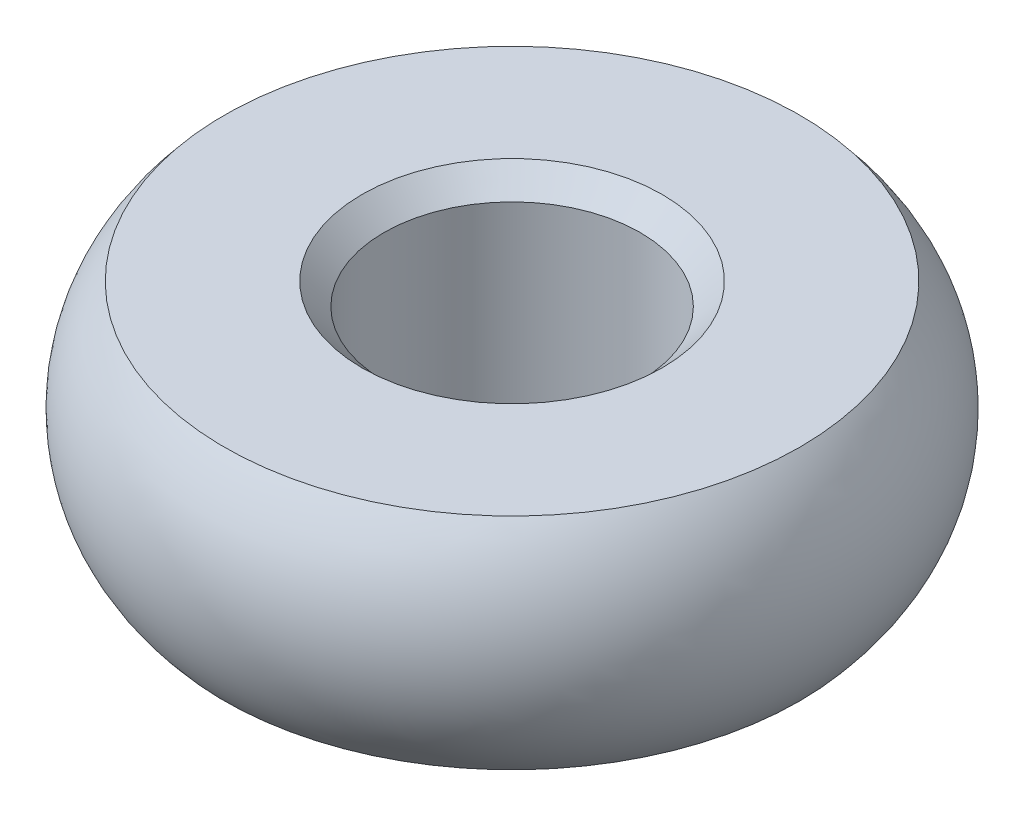
ISO-10303-21;
HEADER;
FILE_DESCRIPTION(('STEP AP214'),'2;1');
FILE_NAME('part.step','',(''),(''),'','','');
FILE_SCHEMA(('AUTOMOTIVE_DESIGN { 1 0 10303 214 1 1 1 1 }'));
ENDSEC;
DATA;
#1=APPLICATION_CONTEXT('core data for automotive mechanical design processes');
#2=APPLICATION_PROTOCOL_DEFINITION('international standard','automotive_design',2000,#1);
#3=PRODUCT_CONTEXT('',#1,'mechanical');
#4=PRODUCT('Part','Part','',(#3));
#5=PRODUCT_RELATED_PRODUCT_CATEGORY('part','',(#4));
#6=PRODUCT_DEFINITION_FORMATION('','',#4);
#7=PRODUCT_DEFINITION_CONTEXT('part definition',#1,'design');
#8=PRODUCT_DEFINITION('design','',#6,#7);
#9=PRODUCT_DEFINITION_SHAPE('','',#8);
#10=(LENGTH_UNIT() NAMED_UNIT(*) SI_UNIT(.MILLI.,.METRE.));
#11=(NAMED_UNIT(*) PLANE_ANGLE_UNIT() SI_UNIT($,.RADIAN.));
#12=(NAMED_UNIT(*) SI_UNIT($,.STERADIAN.) SOLID_ANGLE_UNIT());
#13=UNCERTAINTY_MEASURE_WITH_UNIT(LENGTH_MEASURE(1.E-05),#10,'distance_accuracy_value','');
#14=(GEOMETRIC_REPRESENTATION_CONTEXT(3) GLOBAL_UNCERTAINTY_ASSIGNED_CONTEXT((#13)) GLOBAL_UNIT_ASSIGNED_CONTEXT((#10,
#11,#12)) REPRESENTATION_CONTEXT('',''));
#15=CARTESIAN_POINT('',(0.,0.,0.));
#16=DIRECTION('',(0.,0.,1.));
#17=DIRECTION('',(1.,0.,0.));
#18=AXIS2_PLACEMENT_3D('',#15,#16,#17);
#19=CARTESIAN_POINT('',(0.,-1.11022302462516E-13,0.));
#20=DIRECTION('',(0.,-1.,0.));
#21=DIRECTION('',(1.,0.,0.));
#22=AXIS2_PLACEMENT_3D('',#19,#20,#21);
#23=TOROIDAL_SURFACE('',#22,22.5,22.5);
#24=CARTESIAN_POINT('',(0.,14.9999999999999,0.));
#25=DIRECTION('',(0.,-1.,0.));
#26=DIRECTION('',(1.,0.,0.));
#27=AXIS2_PLACEMENT_3D('',#24,#25,#26);
#28=CIRCLE('',#27,39.2705098312485);
#29=CARTESIAN_POINT('',(39.2705098312485,15.,0.));
#30=VERTEX_POINT('',#29);
#31=EDGE_CURVE('E56',#30,#30,#28,.T.);
#32=ORIENTED_EDGE('',*,*,#31,.T.);
#33=EDGE_LOOP('',(#32));
#34=FACE_BOUND('',#33,.T.);
#35=CARTESIAN_POINT('',(0.,-15.0000000000001,0.));
#36=DIRECTION('',(0.,-1.,0.));
#37=DIRECTION('',(1.,0.,0.));
#38=AXIS2_PLACEMENT_3D('',#35,#36,#37);
#39=CIRCLE('',#38,39.2705098312484);
#40=CARTESIAN_POINT('',(39.2705098312485,-15.,0.));
#41=VERTEX_POINT('',#40);
#42=EDGE_CURVE('E53',#41,#41,#39,.T.);
#43=ORIENTED_EDGE('',*,*,#42,.F.);
#44=EDGE_LOOP('',(#43));
#45=FACE_BOUND('',#44,.T.);
#46=ADVANCED_FACE('F32',(#34,#45),#23,.T.);
#47=CARTESIAN_POINT('',(17.5,-15.,0.));
#48=DIRECTION('',(0.,-1.,0.));
#49=DIRECTION('',(1.,0.,0.));
#50=AXIS2_PLACEMENT_3D('',#47,#48,#49);
#51=PLANE('',#50);
#52=CARTESIAN_POINT('',(0.,-15.0000000000001,0.));
#53=DIRECTION('',(0.,-1.,0.));
#54=DIRECTION('',(1.,0.,0.));
#55=AXIS2_PLACEMENT_3D('',#52,#53,#54);
#56=CIRCLE('',#55,20.4999999999998);
#57=CARTESIAN_POINT('',(20.4999999999998,-15.,0.));
#58=VERTEX_POINT('',#57);
#59=EDGE_CURVE('E10',#58,#58,#56,.F.);
#60=ORIENTED_EDGE('',*,*,#59,.T.);
#61=EDGE_LOOP('',(#60));
#62=FACE_BOUND('',#61,.T.);
#63=ORIENTED_EDGE('',*,*,#42,.T.);
#64=EDGE_LOOP('',(#63));
#65=FACE_BOUND('',#64,.T.);
#66=ADVANCED_FACE('F73',(#62,#65),#51,.T.);
#67=CARTESIAN_POINT('',(2.72490891375703E-12,-794.376418342268,0.));
#68=DIRECTION('',(0.,-1.,0.));
#69=DIRECTION('',(1.,0.,0.));
#70=AXIS2_PLACEMENT_3D('',#67,#68,#69);
#71=CYLINDRICAL_SURFACE('',#70,17.5);
#72=CARTESIAN_POINT('',(0.,11.9999999999999,0.));
#73=DIRECTION('',(0.,1.,0.));
#74=DIRECTION('',(-1.,0.,0.));
#75=AXIS2_PLACEMENT_3D('',#72,#73,#74);
#76=CIRCLE('',#75,17.5);
#77=CARTESIAN_POINT('',(-17.5,11.9999999999998,0.));
#78=VERTEX_POINT('',#77);
#79=EDGE_CURVE('E40',#78,#78,#76,.T.);
#80=ORIENTED_EDGE('',*,*,#79,.T.);
#81=EDGE_LOOP('',(#80));
#82=FACE_BOUND('',#81,.T.);
#83=CARTESIAN_POINT('',(0.,-12.0000000000003,0.));
#84=DIRECTION('',(0.,-1.,0.));
#85=DIRECTION('',(1.,0.,0.));
#86=AXIS2_PLACEMENT_3D('',#83,#84,#85);
#87=CIRCLE('',#86,17.5);
#88=CARTESIAN_POINT('',(17.5,-12.0000000000003,0.));
#89=VERTEX_POINT('',#88);
#90=EDGE_CURVE('E44',#89,#89,#87,.T.);
#91=ORIENTED_EDGE('',*,*,#90,.T.);
#92=EDGE_LOOP('',(#91));
#93=FACE_BOUND('',#92,.T.);
#94=ADVANCED_FACE('F65',(#82,#93),#71,.F.);
#95=CARTESIAN_POINT('',(39.2705098312485,15.,0.));
#96=DIRECTION('',(0.,1.,0.));
#97=DIRECTION('',(-1.,0.,0.));
#98=AXIS2_PLACEMENT_3D('',#95,#96,#97);
#99=PLANE('',#98);
#100=CARTESIAN_POINT('',(0.,14.9999999999999,0.));
#101=DIRECTION('',(0.,1.,0.));
#102=DIRECTION('',(-1.,0.,0.));
#103=AXIS2_PLACEMENT_3D('',#100,#101,#102);
#104=CIRCLE('',#103,20.5);
#105=CARTESIAN_POINT('',(-20.5000000000001,14.9999999999998,0.));
#106=VERTEX_POINT('',#105);
#107=EDGE_CURVE('E48',#106,#106,#104,.F.);
#108=ORIENTED_EDGE('',*,*,#107,.T.);
#109=EDGE_LOOP('',(#108));
#110=FACE_BOUND('',#109,.T.);
#111=ORIENTED_EDGE('',*,*,#31,.F.);
#112=EDGE_LOOP('',(#111));
#113=FACE_BOUND('',#112,.T.);
#114=ADVANCED_FACE('F62',(#110,#113),#99,.T.);
#115=CARTESIAN_POINT('',(0.,14.9999999999999,0.));
#116=DIRECTION('',(0.,1.,0.));
#117=DIRECTION('',(-1.,0.,0.));
#118=AXIS2_PLACEMENT_3D('',#115,#116,#117);
#119=CONICAL_SURFACE('',#118,20.5,0.785398163397456);
#120=ORIENTED_EDGE('',*,*,#79,.F.);
#121=EDGE_LOOP('',(#120));
#122=FACE_BOUND('',#121,.T.);
#123=ORIENTED_EDGE('',*,*,#107,.F.);
#124=EDGE_LOOP('',(#123));
#125=FACE_BOUND('',#124,.T.);
#126=ADVANCED_FACE('F64',(#122,#125),#119,.F.);
#127=CARTESIAN_POINT('',(0.,-12.0000000000003,0.));
#128=DIRECTION('',(0.,-1.,0.));
#129=DIRECTION('',(1.,0.,0.));
#130=AXIS2_PLACEMENT_3D('',#127,#128,#129);
#131=CONICAL_SURFACE('',#130,17.5,0.78539816339746);
#132=ORIENTED_EDGE('',*,*,#59,.F.);
#133=EDGE_LOOP('',(#132));
#134=FACE_BOUND('',#133,.T.);
#135=ORIENTED_EDGE('',*,*,#90,.F.);
#136=EDGE_LOOP('',(#135));
#137=FACE_BOUND('',#136,.T.);
#138=ADVANCED_FACE('F35',(#134,#137),#131,.F.);
#139=CLOSED_SHELL('',(#46,#66,#94,#114,#126,#138));
#140=MANIFOLD_SOLID_BREP('B2',#139);
#141=ADVANCED_BREP_SHAPE_REPRESENTATION('',(#18,#140),#14);
#142=SHAPE_DEFINITION_REPRESENTATION(#9,#141);
ENDSEC;
END-ISO-10303-21;
